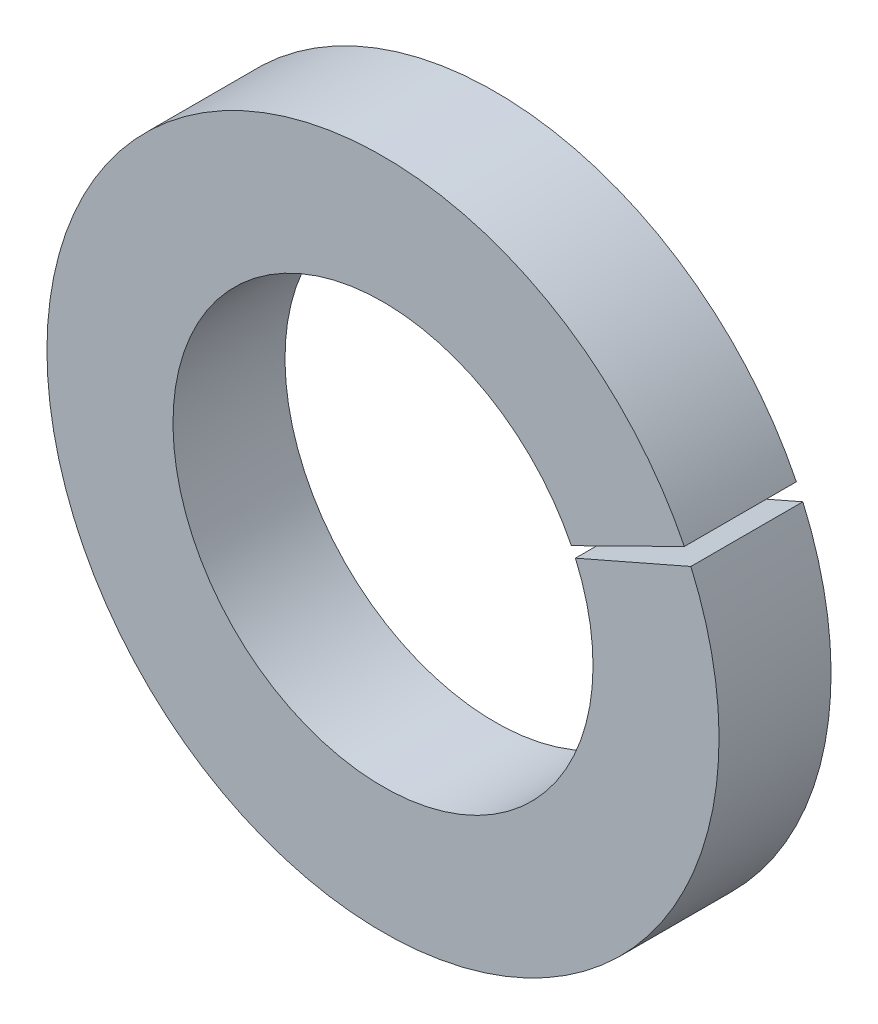
ISO-10303-21;
HEADER;
FILE_DESCRIPTION(('STEP AP214'),'2;1');
FILE_NAME('part.step','',(''),(''),'','','');
FILE_SCHEMA(('AUTOMOTIVE_DESIGN { 1 0 10303 214 1 1 1 1 }'));
ENDSEC;
DATA;
#1=APPLICATION_CONTEXT('core data for automotive mechanical design processes');
#2=APPLICATION_PROTOCOL_DEFINITION('international standard','automotive_design',2000,#1);
#3=PRODUCT_CONTEXT('',#1,'mechanical');
#4=PRODUCT('Part','Part','',(#3));
#5=PRODUCT_RELATED_PRODUCT_CATEGORY('part','',(#4));
#6=PRODUCT_DEFINITION_FORMATION('','',#4);
#7=PRODUCT_DEFINITION_CONTEXT('part definition',#1,'design');
#8=PRODUCT_DEFINITION('design','',#6,#7);
#9=PRODUCT_DEFINITION_SHAPE('','',#8);
#10=(LENGTH_UNIT() NAMED_UNIT(*) SI_UNIT(.MILLI.,.METRE.));
#11=(NAMED_UNIT(*) PLANE_ANGLE_UNIT() SI_UNIT($,.RADIAN.));
#12=(NAMED_UNIT(*) SI_UNIT($,.STERADIAN.) SOLID_ANGLE_UNIT());
#13=UNCERTAINTY_MEASURE_WITH_UNIT(LENGTH_MEASURE(1.E-05),#10,'distance_accuracy_value','');
#14=(GEOMETRIC_REPRESENTATION_CONTEXT(3) GLOBAL_UNCERTAINTY_ASSIGNED_CONTEXT((#13)) GLOBAL_UNIT_ASSIGNED_CONTEXT((#10,
#11,#12)) REPRESENTATION_CONTEXT('',''));
#15=CARTESIAN_POINT('',(0.,0.,0.));
#16=DIRECTION('',(0.,0.,1.));
#17=DIRECTION('',(1.,0.,0.));
#18=AXIS2_PLACEMENT_3D('',#15,#16,#17);
#19=CARTESIAN_POINT('',(0.,0.,1.6));
#20=DIRECTION('',(0.,0.,1.));
#21=DIRECTION('',(1.,0.,0.));
#22=AXIS2_PLACEMENT_3D('',#19,#20,#21);
#23=PLANE('',#22);
#24=DIRECTION('',(0.91612800253932,0.400885872741003,0.));
#25=VECTOR('',#24,1.);
#26=CARTESIAN_POINT('',(4.81245926481222,2.10587049741662,1.6));
#27=LINE('',#26,#25);
#28=CARTESIAN_POINT('',(2.74838400761796,1.20265761822301,1.6));
#29=VERTEX_POINT('',#28);
#30=CARTESIAN_POINT('',(4.39741441218874,1.92425218915681,1.6));
#31=VERTEX_POINT('',#30);
#32=EDGE_CURVE('E81',#29,#31,#27,.T.);
#33=ORIENTED_EDGE('',*,*,#32,.F.);
#34=CARTESIAN_POINT('',(0.,0.,1.6));
#35=DIRECTION('',(0.,0.,1.));
#36=DIRECTION('',(1.,0.,0.));
#37=AXIS2_PLACEMENT_3D('',#34,#35,#36);
#38=CIRCLE('',#37,3.);
#39=CARTESIAN_POINT('',(2.69010138952241,1.32791359436131,1.6));
#40=VERTEX_POINT('',#39);
#41=EDGE_CURVE('E90',#40,#29,#38,.T.);
#42=ORIENTED_EDGE('',*,*,#41,.F.);
#43=DIRECTION('',(-0.896700463174137,-0.442637864787105,0.));
#44=VECTOR('',#43,1.);
#45=CARTESIAN_POINT('',(0.,0.,1.6));
#46=LINE('',#45,#44);
#47=CARTESIAN_POINT('',(4.30416222323586,2.1246617509781,1.6));
#48=VERTEX_POINT('',#47);
#49=EDGE_CURVE('E64',#48,#40,#46,.T.);
#50=ORIENTED_EDGE('',*,*,#49,.F.);
#51=CARTESIAN_POINT('',(0.,0.,1.6));
#52=DIRECTION('',(0.,0.,1.));
#53=DIRECTION('',(1.,0.,0.));
#54=AXIS2_PLACEMENT_3D('',#51,#52,#53);
#55=CIRCLE('',#54,4.8);
#56=EDGE_CURVE('E92',#48,#31,#55,.T.);
#57=ORIENTED_EDGE('',*,*,#56,.T.);
#58=EDGE_LOOP('',(#33,#42,#50,#57));
#59=FACE_BOUND('',#58,.T.);
#60=ADVANCED_FACE('F41',(#59),#23,.T.);
#61=CARTESIAN_POINT('',(0.,0.,0.));
#62=DIRECTION('',(0.,0.,1.));
#63=DIRECTION('',(1.,0.,0.));
#64=AXIS2_PLACEMENT_3D('',#61,#62,#63);
#65=PLANE('',#64);
#66=CARTESIAN_POINT('',(0.,0.,0.));
#67=DIRECTION('',(0.,0.,1.));
#68=DIRECTION('',(1.,0.,0.));
#69=AXIS2_PLACEMENT_3D('',#66,#67,#68);
#70=CIRCLE('',#69,3.);
#71=CARTESIAN_POINT('',(2.69010138952241,1.32791359436131,0.));
#72=VERTEX_POINT('',#71);
#73=CARTESIAN_POINT('',(2.74838400761796,1.20265761822301,0.));
#74=VERTEX_POINT('',#73);
#75=EDGE_CURVE('E98',#72,#74,#70,.T.);
#76=ORIENTED_EDGE('',*,*,#75,.T.);
#77=DIRECTION('',(0.91612800253932,0.400885872741003,0.));
#78=VECTOR('',#77,1.);
#79=CARTESIAN_POINT('',(0.,0.,0.));
#80=LINE('',#79,#78);
#81=CARTESIAN_POINT('',(4.39741441218874,1.92425218915681,0.));
#82=VERTEX_POINT('',#81);
#83=EDGE_CURVE('E56',#74,#82,#80,.T.);
#84=ORIENTED_EDGE('',*,*,#83,.T.);
#85=CARTESIAN_POINT('',(0.,0.,0.));
#86=DIRECTION('',(0.,0.,1.));
#87=DIRECTION('',(1.,0.,0.));
#88=AXIS2_PLACEMENT_3D('',#85,#86,#87);
#89=CIRCLE('',#88,4.8);
#90=CARTESIAN_POINT('',(4.30416222323586,2.1246617509781,0.));
#91=VERTEX_POINT('',#90);
#92=EDGE_CURVE('E97',#91,#82,#89,.T.);
#93=ORIENTED_EDGE('',*,*,#92,.F.);
#94=DIRECTION('',(-0.896700463174138,-0.442637864787105,0.));
#95=VECTOR('',#94,1.);
#96=CARTESIAN_POINT('',(0.,0.,0.));
#97=LINE('',#96,#95);
#98=EDGE_CURVE('E113',#91,#72,#97,.T.);
#99=ORIENTED_EDGE('',*,*,#98,.T.);
#100=EDGE_LOOP('',(#76,#84,#93,#99));
#101=FACE_BOUND('',#100,.T.);
#102=ADVANCED_FACE('F117',(#101),#65,.F.);
#103=CARTESIAN_POINT('',(0.,0.,1.6));
#104=DIRECTION('',(0.,0.,-1.));
#105=DIRECTION('',(-1.,0.,0.));
#106=AXIS2_PLACEMENT_3D('',#103,#104,#105);
#107=CYLINDRICAL_SURFACE('',#106,4.8);
#108=ORIENTED_EDGE('',*,*,#92,.T.);
#109=DIRECTION('',(0.,0.,-1.));
#110=VECTOR('',#109,1.);
#111=CARTESIAN_POINT('',(4.39741441218874,1.92425218915681,1.6));
#112=LINE('',#111,#110);
#113=EDGE_CURVE('E104',#82,#31,#112,.F.);
#114=ORIENTED_EDGE('',*,*,#113,.T.);
#115=ORIENTED_EDGE('',*,*,#56,.F.);
#116=DIRECTION('',(0.,0.,-1.));
#117=VECTOR('',#116,1.);
#118=CARTESIAN_POINT('',(4.30416222323586,2.1246617509781,1.6));
#119=LINE('',#118,#117);
#120=EDGE_CURVE('E119',#48,#91,#119,.T.);
#121=ORIENTED_EDGE('',*,*,#120,.T.);
#122=EDGE_LOOP('',(#108,#114,#115,#121));
#123=FACE_BOUND('',#122,.T.);
#124=ADVANCED_FACE('F43',(#123),#107,.T.);
#125=CARTESIAN_POINT('',(0.,0.,1.6));
#126=DIRECTION('',(0.,0.,-1.));
#127=DIRECTION('',(-1.,0.,0.));
#128=AXIS2_PLACEMENT_3D('',#125,#126,#127);
#129=CYLINDRICAL_SURFACE('',#128,3.);
#130=DIRECTION('',(0.,0.,-1.));
#131=VECTOR('',#130,1.);
#132=CARTESIAN_POINT('',(2.74838400761796,1.20265761822301,1.6));
#133=LINE('',#132,#131);
#134=EDGE_CURVE('E11',#74,#29,#133,.F.);
#135=ORIENTED_EDGE('',*,*,#134,.F.);
#136=ORIENTED_EDGE('',*,*,#75,.F.);
#137=DIRECTION('',(0.,0.,-1.));
#138=VECTOR('',#137,1.);
#139=CARTESIAN_POINT('',(2.69010138952241,1.32791359436131,1.6));
#140=LINE('',#139,#138);
#141=EDGE_CURVE('E50',#40,#72,#140,.T.);
#142=ORIENTED_EDGE('',*,*,#141,.F.);
#143=ORIENTED_EDGE('',*,*,#41,.T.);
#144=EDGE_LOOP('',(#135,#136,#142,#143));
#145=FACE_BOUND('',#144,.T.);
#146=ADVANCED_FACE('F95',(#145),#129,.F.);
#147=CARTESIAN_POINT('',(0.,0.,-8.4));
#148=DIRECTION('',(-0.442637864787105,0.896700463174138,0.));
#149=DIRECTION('',(-0.896700463174138,-0.442637864787105,0.));
#150=AXIS2_PLACEMENT_3D('',#147,#148,#149);
#151=PLANE('',#150);
#152=ORIENTED_EDGE('',*,*,#49,.T.);
#153=ORIENTED_EDGE('',*,*,#141,.T.);
#154=ORIENTED_EDGE('',*,*,#98,.F.);
#155=ORIENTED_EDGE('',*,*,#120,.F.);
#156=EDGE_LOOP('',(#152,#153,#154,#155));
#157=FACE_BOUND('',#156,.T.);
#158=ADVANCED_FACE('F112',(#157),#151,.F.);
#159=CARTESIAN_POINT('',(4.81245926481222,2.10587049741662,-8.4));
#160=DIRECTION('',(0.400885872741003,-0.91612800253932,0.));
#161=DIRECTION('',(0.91612800253932,0.400885872741003,0.));
#162=AXIS2_PLACEMENT_3D('',#159,#160,#161);
#163=PLANE('',#162);
#164=ORIENTED_EDGE('',*,*,#83,.F.);
#165=ORIENTED_EDGE('',*,*,#134,.T.);
#166=ORIENTED_EDGE('',*,*,#32,.T.);
#167=ORIENTED_EDGE('',*,*,#113,.F.);
#168=EDGE_LOOP('',(#164,#165,#166,#167));
#169=FACE_BOUND('',#168,.T.);
#170=ADVANCED_FACE('F80',(#169),#163,.F.);
#171=CLOSED_SHELL('',(#60,#102,#124,#146,#158,#170));
#172=MANIFOLD_SOLID_BREP('B2',#171);
#173=ADVANCED_BREP_SHAPE_REPRESENTATION('',(#18,#172),#14);
#174=SHAPE_DEFINITION_REPRESENTATION(#9,#173);
ENDSEC;
END-ISO-10303-21;
